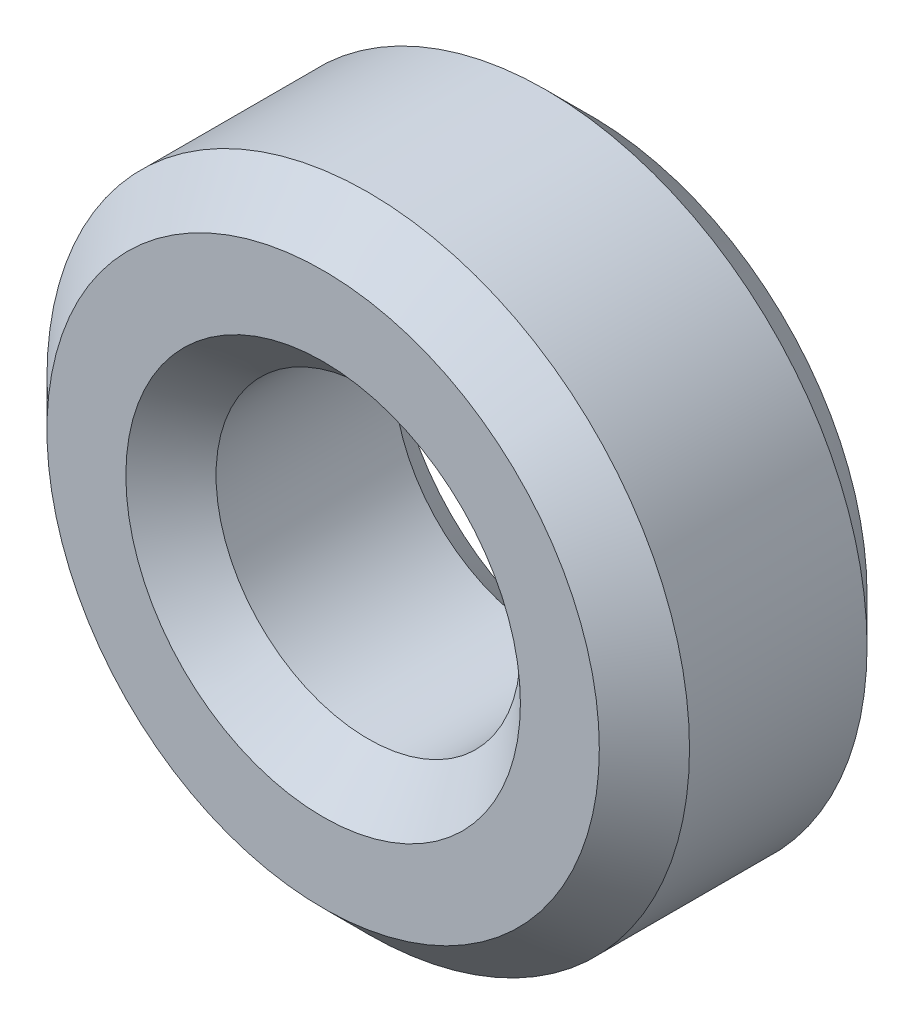
ISO-10303-21;
HEADER;
FILE_DESCRIPTION(('STEP AP214'),'2;1');
FILE_NAME('part.step','',(''),(''),'','','');
FILE_SCHEMA(('AUTOMOTIVE_DESIGN { 1 0 10303 214 1 1 1 1 }'));
ENDSEC;
DATA;
#1=APPLICATION_CONTEXT('core data for automotive mechanical design processes');
#2=APPLICATION_PROTOCOL_DEFINITION('international standard','automotive_design',2000,#1);
#3=PRODUCT_CONTEXT('',#1,'mechanical');
#4=PRODUCT('Part','Part','',(#3));
#5=PRODUCT_RELATED_PRODUCT_CATEGORY('part','',(#4));
#6=PRODUCT_DEFINITION_FORMATION('','',#4);
#7=PRODUCT_DEFINITION_CONTEXT('part definition',#1,'design');
#8=PRODUCT_DEFINITION('design','',#6,#7);
#9=PRODUCT_DEFINITION_SHAPE('','',#8);
#10=(LENGTH_UNIT() NAMED_UNIT(*) SI_UNIT(.MILLI.,.METRE.));
#11=(NAMED_UNIT(*) PLANE_ANGLE_UNIT() SI_UNIT($,.RADIAN.));
#12=(NAMED_UNIT(*) SI_UNIT($,.STERADIAN.) SOLID_ANGLE_UNIT());
#13=UNCERTAINTY_MEASURE_WITH_UNIT(LENGTH_MEASURE(1.E-05),#10,'distance_accuracy_value','');
#14=(GEOMETRIC_REPRESENTATION_CONTEXT(3) GLOBAL_UNCERTAINTY_ASSIGNED_CONTEXT((#13)) GLOBAL_UNIT_ASSIGNED_CONTEXT((#10,
#11,#12)) REPRESENTATION_CONTEXT('',''));
#15=CARTESIAN_POINT('',(0.,0.,0.));
#16=DIRECTION('',(0.,0.,1.));
#17=DIRECTION('',(1.,0.,0.));
#18=AXIS2_PLACEMENT_3D('',#15,#16,#17);
#19=CARTESIAN_POINT('',(0.,0.,4.75));
#20=DIRECTION('',(0.,0.,1.));
#21=DIRECTION('',(1.,0.,0.));
#22=AXIS2_PLACEMENT_3D('',#19,#20,#21);
#23=PLANE('',#22);
#24=CARTESIAN_POINT('',(0.,0.,4.75));
#25=DIRECTION('',(0.,0.,1.));
#26=DIRECTION('',(1.,0.,0.));
#27=AXIS2_PLACEMENT_3D('',#24,#25,#26);
#28=CIRCLE('',#27,3.50000000000001);
#29=CARTESIAN_POINT('',(3.50000000000001,0.,4.75));
#30=VERTEX_POINT('',#29);
#31=EDGE_CURVE('E10',#30,#30,#28,.F.);
#32=ORIENTED_EDGE('',*,*,#31,.T.);
#33=EDGE_LOOP('',(#32));
#34=FACE_BOUND('',#33,.T.);
#35=CARTESIAN_POINT('',(0.,0.,4.75));
#36=DIRECTION('',(0.,0.,1.));
#37=DIRECTION('',(1.,0.,0.));
#38=AXIS2_PLACEMENT_3D('',#35,#36,#37);
#39=CIRCLE('',#38,4.9);
#40=CARTESIAN_POINT('',(4.9,0.,4.75));
#41=VERTEX_POINT('',#40);
#42=EDGE_CURVE('E38',#41,#41,#39,.T.);
#43=ORIENTED_EDGE('',*,*,#42,.T.);
#44=EDGE_LOOP('',(#43));
#45=FACE_BOUND('',#44,.T.);
#46=ADVANCED_FACE('F31',(#34,#45),#23,.T.);
#47=CARTESIAN_POINT('',(0.,0.,0.));
#48=DIRECTION('',(0.,0.,1.));
#49=DIRECTION('',(1.,0.,0.));
#50=AXIS2_PLACEMENT_3D('',#47,#48,#49);
#51=PLANE('',#50);
#52=CARTESIAN_POINT('',(0.,0.,0.));
#53=DIRECTION('',(0.,0.,1.));
#54=DIRECTION('',(1.,0.,0.));
#55=AXIS2_PLACEMENT_3D('',#52,#53,#54);
#56=CIRCLE('',#55,3.5);
#57=CARTESIAN_POINT('',(3.5,0.,0.));
#58=VERTEX_POINT('',#57);
#59=EDGE_CURVE('E57',#58,#58,#56,.T.);
#60=ORIENTED_EDGE('',*,*,#59,.T.);
#61=EDGE_LOOP('',(#60));
#62=FACE_BOUND('',#61,.T.);
#63=CARTESIAN_POINT('',(0.,0.,0.));
#64=DIRECTION('',(0.,0.,1.));
#65=DIRECTION('',(1.,0.,0.));
#66=AXIS2_PLACEMENT_3D('',#63,#64,#65);
#67=CIRCLE('',#66,4.9);
#68=CARTESIAN_POINT('',(4.9,0.,0.));
#69=VERTEX_POINT('',#68);
#70=EDGE_CURVE('E60',#69,#69,#67,.F.);
#71=ORIENTED_EDGE('',*,*,#70,.T.);
#72=EDGE_LOOP('',(#71));
#73=FACE_BOUND('',#72,.T.);
#74=ADVANCED_FACE('F64',(#62,#73),#51,.F.);
#75=CARTESIAN_POINT('',(0.,0.,4.75));
#76=DIRECTION('',(0.,0.,-1.));
#77=DIRECTION('',(-1.,0.,0.));
#78=AXIS2_PLACEMENT_3D('',#75,#76,#77);
#79=CYLINDRICAL_SURFACE('',#78,5.7);
#80=CARTESIAN_POINT('',(0.,0.,0.800000000000001));
#81=DIRECTION('',(0.,0.,1.));
#82=DIRECTION('',(1.,0.,0.));
#83=AXIS2_PLACEMENT_3D('',#80,#81,#82);
#84=CIRCLE('',#83,5.7);
#85=CARTESIAN_POINT('',(5.7,0.,0.800000000000001));
#86=VERTEX_POINT('',#85);
#87=EDGE_CURVE('E42',#86,#86,#84,.T.);
#88=ORIENTED_EDGE('',*,*,#87,.T.);
#89=EDGE_LOOP('',(#88));
#90=FACE_BOUND('',#89,.T.);
#91=CARTESIAN_POINT('',(0.,0.,3.94999999999999));
#92=DIRECTION('',(0.,0.,1.));
#93=DIRECTION('',(1.,0.,0.));
#94=AXIS2_PLACEMENT_3D('',#91,#92,#93);
#95=CIRCLE('',#94,5.7);
#96=CARTESIAN_POINT('',(5.7,0.,3.94999999999999));
#97=VERTEX_POINT('',#96);
#98=EDGE_CURVE('E46',#97,#97,#95,.F.);
#99=ORIENTED_EDGE('',*,*,#98,.T.);
#100=EDGE_LOOP('',(#99));
#101=FACE_BOUND('',#100,.T.);
#102=ADVANCED_FACE('F74',(#90,#101),#79,.T.);
#103=CARTESIAN_POINT('',(0.,0.,4.75));
#104=DIRECTION('',(0.,0.,-1.));
#105=DIRECTION('',(-1.,0.,0.));
#106=AXIS2_PLACEMENT_3D('',#103,#104,#105);
#107=CYLINDRICAL_SURFACE('',#106,2.7);
#108=CARTESIAN_POINT('',(0.,0.,0.800000000000001));
#109=DIRECTION('',(0.,0.,1.));
#110=DIRECTION('',(1.,0.,0.));
#111=AXIS2_PLACEMENT_3D('',#108,#109,#110);
#112=CIRCLE('',#111,2.7);
#113=CARTESIAN_POINT('',(2.7,0.,0.800000000000001));
#114=VERTEX_POINT('',#113);
#115=EDGE_CURVE('E51',#114,#114,#112,.F.);
#116=ORIENTED_EDGE('',*,*,#115,.T.);
#117=EDGE_LOOP('',(#116));
#118=FACE_BOUND('',#117,.T.);
#119=CARTESIAN_POINT('',(0.,0.,3.95));
#120=DIRECTION('',(0.,0.,1.));
#121=DIRECTION('',(1.,0.,0.));
#122=AXIS2_PLACEMENT_3D('',#119,#120,#121);
#123=CIRCLE('',#122,2.7);
#124=CARTESIAN_POINT('',(2.7,0.,3.95));
#125=VERTEX_POINT('',#124);
#126=EDGE_CURVE('E54',#125,#125,#123,.T.);
#127=ORIENTED_EDGE('',*,*,#126,.T.);
#128=EDGE_LOOP('',(#127));
#129=FACE_BOUND('',#128,.T.);
#130=ADVANCED_FACE('F77',(#118,#129),#107,.F.);
#131=CARTESIAN_POINT('',(0.,0.,0.));
#132=DIRECTION('',(0.,0.,-1.));
#133=DIRECTION('',(-1.,0.,0.));
#134=AXIS2_PLACEMENT_3D('',#131,#132,#133);
#135=CONICAL_SURFACE('',#134,3.5,0.785398163397447);
#136=ORIENTED_EDGE('',*,*,#115,.F.);
#137=EDGE_LOOP('',(#136));
#138=FACE_BOUND('',#137,.T.);
#139=ORIENTED_EDGE('',*,*,#59,.F.);
#140=EDGE_LOOP('',(#139));
#141=FACE_BOUND('',#140,.T.);
#142=ADVANCED_FACE('F70',(#138,#141),#135,.F.);
#143=CARTESIAN_POINT('',(0.,0.,0.800000000000001));
#144=DIRECTION('',(0.,0.,1.));
#145=DIRECTION('',(1.,0.,0.));
#146=AXIS2_PLACEMENT_3D('',#143,#144,#145);
#147=CONICAL_SURFACE('',#146,5.7,0.785398163397449);
#148=ORIENTED_EDGE('',*,*,#70,.F.);
#149=EDGE_LOOP('',(#148));
#150=FACE_BOUND('',#149,.T.);
#151=ORIENTED_EDGE('',*,*,#87,.F.);
#152=EDGE_LOOP('',(#151));
#153=FACE_BOUND('',#152,.T.);
#154=ADVANCED_FACE('F66',(#150,#153),#147,.T.);
#155=CARTESIAN_POINT('',(0.,0.,3.95));
#156=DIRECTION('',(0.,0.,1.));
#157=DIRECTION('',(1.,0.,0.));
#158=AXIS2_PLACEMENT_3D('',#155,#156,#157);
#159=CONICAL_SURFACE('',#158,2.7,0.78539816339745);
#160=ORIENTED_EDGE('',*,*,#31,.F.);
#161=EDGE_LOOP('',(#160));
#162=FACE_BOUND('',#161,.T.);
#163=ORIENTED_EDGE('',*,*,#126,.F.);
#164=EDGE_LOOP('',(#163));
#165=FACE_BOUND('',#164,.T.);
#166=ADVANCED_FACE('F69',(#162,#165),#159,.F.);
#167=CARTESIAN_POINT('',(0.,0.,4.75));
#168=DIRECTION('',(0.,0.,-1.));
#169=DIRECTION('',(-1.,0.,0.));
#170=AXIS2_PLACEMENT_3D('',#167,#168,#169);
#171=CONICAL_SURFACE('',#170,4.9,0.785398163397447);
#172=ORIENTED_EDGE('',*,*,#98,.F.);
#173=EDGE_LOOP('',(#172));
#174=FACE_BOUND('',#173,.T.);
#175=ORIENTED_EDGE('',*,*,#42,.F.);
#176=EDGE_LOOP('',(#175));
#177=FACE_BOUND('',#176,.T.);
#178=ADVANCED_FACE('F33',(#174,#177),#171,.T.);
#179=CLOSED_SHELL('',(#46,#74,#102,#130,#142,#154,#166,#178));
#180=MANIFOLD_SOLID_BREP('B2',#179);
#181=ADVANCED_BREP_SHAPE_REPRESENTATION('',(#18,#180),#14);
#182=SHAPE_DEFINITION_REPRESENTATION(#9,#181);
ENDSEC;
END-ISO-10303-21;
